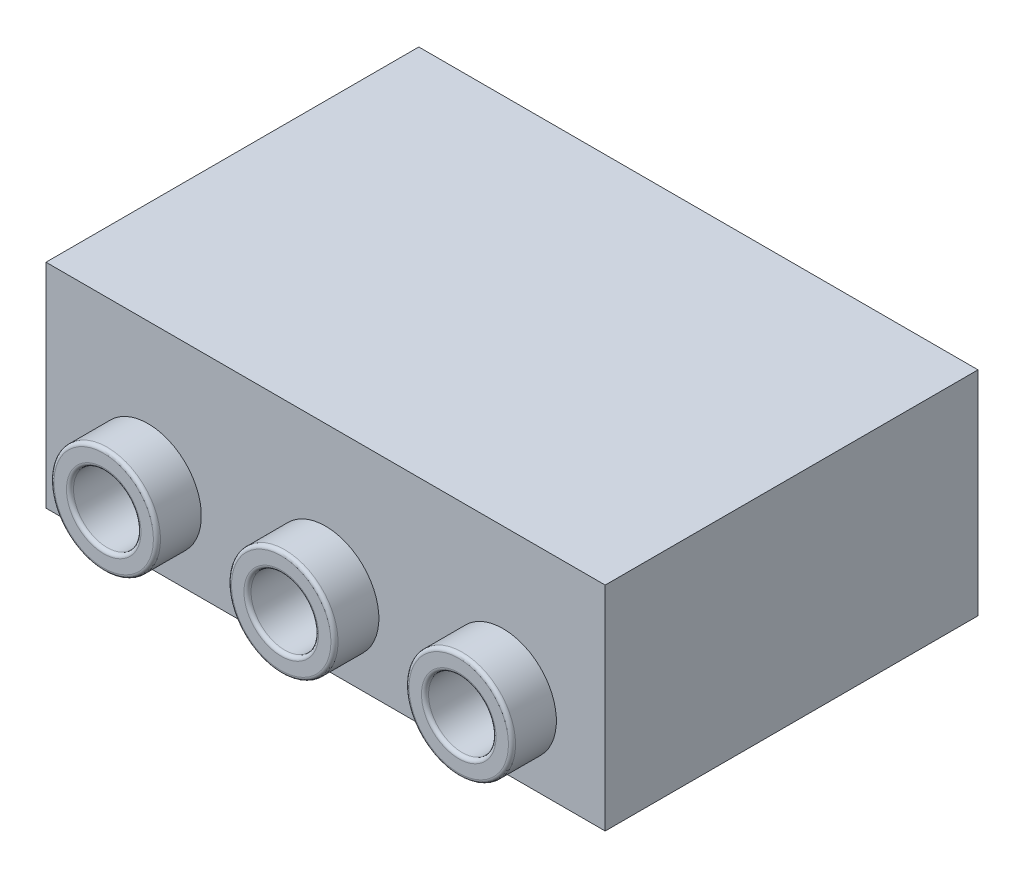
ISO-10303-21;
HEADER;
FILE_DESCRIPTION(('STEP AP214'),'2;1');
FILE_NAME('part.step','',(''),(''),'','','');
FILE_SCHEMA(('AUTOMOTIVE_DESIGN { 1 0 10303 214 1 1 1 1 }'));
ENDSEC;
DATA;
#1=APPLICATION_CONTEXT('core data for automotive mechanical design processes');
#2=APPLICATION_PROTOCOL_DEFINITION('international standard','automotive_design',2000,#1);
#3=PRODUCT_CONTEXT('',#1,'mechanical');
#4=PRODUCT('Part','Part','',(#3));
#5=PRODUCT_RELATED_PRODUCT_CATEGORY('part','',(#4));
#6=PRODUCT_DEFINITION_FORMATION('','',#4);
#7=PRODUCT_DEFINITION_CONTEXT('part definition',#1,'design');
#8=PRODUCT_DEFINITION('design','',#6,#7);
#9=PRODUCT_DEFINITION_SHAPE('','',#8);
#10=(LENGTH_UNIT() NAMED_UNIT(*) SI_UNIT(.MILLI.,.METRE.));
#11=(NAMED_UNIT(*) PLANE_ANGLE_UNIT() SI_UNIT($,.RADIAN.));
#12=(NAMED_UNIT(*) SI_UNIT($,.STERADIAN.) SOLID_ANGLE_UNIT());
#13=UNCERTAINTY_MEASURE_WITH_UNIT(LENGTH_MEASURE(1.E-05),#10,'distance_accuracy_value','');
#14=(GEOMETRIC_REPRESENTATION_CONTEXT(3) GLOBAL_UNCERTAINTY_ASSIGNED_CONTEXT((#13)) GLOBAL_UNIT_ASSIGNED_CONTEXT((#10,
#11,#12)) REPRESENTATION_CONTEXT('',''));
#15=CARTESIAN_POINT('',(0.,0.,0.));
#16=DIRECTION('',(0.,0.,1.));
#17=DIRECTION('',(1.,0.,0.));
#18=AXIS2_PLACEMENT_3D('',#15,#16,#17);
#19=CARTESIAN_POINT('',(15.75,12.,10.5));
#20=DIRECTION('',(-1.,0.,0.));
#21=DIRECTION('',(0.,0.,1.));
#22=AXIS2_PLACEMENT_3D('',#19,#20,#21);
#23=PLANE('',#22);
#24=DIRECTION('',(0.,0.,-1.));
#25=VECTOR('',#24,1.);
#26=CARTESIAN_POINT('',(15.75,0.,10.5));
#27=LINE('',#26,#25);
#28=CARTESIAN_POINT('',(15.75,0.,10.5));
#29=VERTEX_POINT('',#28);
#30=CARTESIAN_POINT('',(15.75,0.,-10.5));
#31=VERTEX_POINT('',#30);
#32=EDGE_CURVE('E121',#29,#31,#27,.T.);
#33=ORIENTED_EDGE('',*,*,#32,.T.);
#34=DIRECTION('',(0.,-1.,0.));
#35=VECTOR('',#34,1.);
#36=CARTESIAN_POINT('',(15.75,12.,-10.5));
#37=LINE('',#36,#35);
#38=CARTESIAN_POINT('',(15.75,12.,-10.5));
#39=VERTEX_POINT('',#38);
#40=EDGE_CURVE('E108',#39,#31,#37,.T.);
#41=ORIENTED_EDGE('',*,*,#40,.F.);
#42=DIRECTION('',(0.,0.,-1.));
#43=VECTOR('',#42,1.);
#44=CARTESIAN_POINT('',(15.75,12.,10.5));
#45=LINE('',#44,#43);
#46=CARTESIAN_POINT('',(15.75,12.,10.5));
#47=VERTEX_POINT('',#46);
#48=EDGE_CURVE('E100',#47,#39,#45,.T.);
#49=ORIENTED_EDGE('',*,*,#48,.F.);
#50=DIRECTION('',(0.,-1.,0.));
#51=VECTOR('',#50,1.);
#52=CARTESIAN_POINT('',(15.75,12.,10.5));
#53=LINE('',#52,#51);
#54=EDGE_CURVE('E117',#47,#29,#53,.T.);
#55=ORIENTED_EDGE('',*,*,#54,.T.);
#56=EDGE_LOOP('',(#33,#41,#49,#55));
#57=FACE_BOUND('',#56,.T.);
#58=ADVANCED_FACE('F44',(#57),#23,.F.);
#59=CARTESIAN_POINT('',(-15.75,12.,-10.5));
#60=DIRECTION('',(0.,0.,1.));
#61=DIRECTION('',(1.,0.,0.));
#62=AXIS2_PLACEMENT_3D('',#59,#60,#61);
#63=PLANE('',#62);
#64=DIRECTION('',(-1.,0.,0.));
#65=VECTOR('',#64,1.);
#66=CARTESIAN_POINT('',(-15.75,0.,-10.5));
#67=LINE('',#66,#65);
#68=CARTESIAN_POINT('',(-15.75,0.,-10.5));
#69=VERTEX_POINT('',#68);
#70=EDGE_CURVE('E106',#31,#69,#67,.T.);
#71=ORIENTED_EDGE('',*,*,#70,.T.);
#72=DIRECTION('',(0.,-1.,0.));
#73=VECTOR('',#72,1.);
#74=CARTESIAN_POINT('',(-15.75,12.,-10.5));
#75=LINE('',#74,#73);
#76=CARTESIAN_POINT('',(-15.75,12.,-10.5));
#77=VERTEX_POINT('',#76);
#78=EDGE_CURVE('E104',#77,#69,#75,.T.);
#79=ORIENTED_EDGE('',*,*,#78,.F.);
#80=DIRECTION('',(-1.,0.,0.));
#81=VECTOR('',#80,1.);
#82=CARTESIAN_POINT('',(-15.75,12.,-10.5));
#83=LINE('',#82,#81);
#84=EDGE_CURVE('E95',#39,#77,#83,.T.);
#85=ORIENTED_EDGE('',*,*,#84,.F.);
#86=ORIENTED_EDGE('',*,*,#40,.T.);
#87=EDGE_LOOP('',(#71,#79,#85,#86));
#88=FACE_BOUND('',#87,.T.);
#89=ADVANCED_FACE('F105',(#88),#63,.F.);
#90=CARTESIAN_POINT('',(-15.75,12.,10.5));
#91=DIRECTION('',(1.,0.,0.));
#92=DIRECTION('',(0.,0.,-1.));
#93=AXIS2_PLACEMENT_3D('',#90,#91,#92);
#94=PLANE('',#93);
#95=DIRECTION('',(0.,0.,1.));
#96=VECTOR('',#95,1.);
#97=CARTESIAN_POINT('',(-15.75,0.,10.5));
#98=LINE('',#97,#96);
#99=CARTESIAN_POINT('',(-15.75,0.,10.5));
#100=VERTEX_POINT('',#99);
#101=EDGE_CURVE('E81',#69,#100,#98,.T.);
#102=ORIENTED_EDGE('',*,*,#101,.T.);
#103=DIRECTION('',(0.,-1.,0.));
#104=VECTOR('',#103,1.);
#105=CARTESIAN_POINT('',(-15.75,12.,10.5));
#106=LINE('',#105,#104);
#107=CARTESIAN_POINT('',(-15.75,12.,10.5));
#108=VERTEX_POINT('',#107);
#109=EDGE_CURVE('E109',#108,#100,#106,.T.);
#110=ORIENTED_EDGE('',*,*,#109,.F.);
#111=DIRECTION('',(0.,0.,1.));
#112=VECTOR('',#111,1.);
#113=CARTESIAN_POINT('',(-15.75,12.,10.5));
#114=LINE('',#113,#112);
#115=EDGE_CURVE('E98',#77,#108,#114,.T.);
#116=ORIENTED_EDGE('',*,*,#115,.F.);
#117=ORIENTED_EDGE('',*,*,#78,.T.);
#118=EDGE_LOOP('',(#102,#110,#116,#117));
#119=FACE_BOUND('',#118,.T.);
#120=ADVANCED_FACE('F111',(#119),#94,.F.);
#121=CARTESIAN_POINT('',(-15.75,12.,10.5));
#122=DIRECTION('',(0.,0.,-1.));
#123=DIRECTION('',(-1.,0.,0.));
#124=AXIS2_PLACEMENT_3D('',#121,#122,#123);
#125=PLANE('',#124);
#126=CARTESIAN_POINT('',(-10.,4.,10.5));
#127=DIRECTION('',(0.,0.,-1.));
#128=DIRECTION('',(-1.,0.,0.));
#129=AXIS2_PLACEMENT_3D('',#126,#127,#128);
#130=CIRCLE('',#129,3.);
#131=CARTESIAN_POINT('',(-13.,4.,10.5));
#132=VERTEX_POINT('',#131);
#133=EDGE_CURVE('E146',#132,#132,#130,.F.);
#134=ORIENTED_EDGE('',*,*,#133,.F.);
#135=EDGE_LOOP('',(#134));
#136=FACE_BOUND('',#135,.T.);
#137=CARTESIAN_POINT('',(10.,4.,10.5));
#138=DIRECTION('',(0.,0.,-1.));
#139=DIRECTION('',(-1.,0.,0.));
#140=AXIS2_PLACEMENT_3D('',#137,#138,#139);
#141=CIRCLE('',#140,3.);
#142=CARTESIAN_POINT('',(7.,4.,10.5));
#143=VERTEX_POINT('',#142);
#144=EDGE_CURVE('E142',#143,#143,#141,.F.);
#145=ORIENTED_EDGE('',*,*,#144,.F.);
#146=EDGE_LOOP('',(#145));
#147=FACE_BOUND('',#146,.T.);
#148=CARTESIAN_POINT('',(0.,4.,10.5));
#149=DIRECTION('',(0.,0.,-1.));
#150=DIRECTION('',(-1.,0.,0.));
#151=AXIS2_PLACEMENT_3D('',#148,#149,#150);
#152=CIRCLE('',#151,3.);
#153=CARTESIAN_POINT('',(-3.,4.,10.5));
#154=VERTEX_POINT('',#153);
#155=EDGE_CURVE('E138',#154,#154,#152,.F.);
#156=ORIENTED_EDGE('',*,*,#155,.F.);
#157=EDGE_LOOP('',(#156));
#158=FACE_BOUND('',#157,.T.);
#159=DIRECTION('',(1.,0.,0.));
#160=VECTOR('',#159,1.);
#161=CARTESIAN_POINT('',(-15.75,0.,10.5));
#162=LINE('',#161,#160);
#163=EDGE_CURVE('E87',#100,#29,#162,.T.);
#164=ORIENTED_EDGE('',*,*,#163,.T.);
#165=ORIENTED_EDGE('',*,*,#54,.F.);
#166=DIRECTION('',(1.,0.,0.));
#167=VECTOR('',#166,1.);
#168=CARTESIAN_POINT('',(-15.75,12.,10.5));
#169=LINE('',#168,#167);
#170=EDGE_CURVE('E64',#108,#47,#169,.T.);
#171=ORIENTED_EDGE('',*,*,#170,.F.);
#172=ORIENTED_EDGE('',*,*,#109,.T.);
#173=EDGE_LOOP('',(#164,#165,#171,#172));
#174=FACE_BOUND('',#173,.T.);
#175=ADVANCED_FACE('F321',(#136,#147,#158,#174),#125,.F.);
#176=CARTESIAN_POINT('',(0.,12.,0.));
#177=DIRECTION('',(0.,-1.,0.));
#178=DIRECTION('',(0.,0.,-1.));
#179=AXIS2_PLACEMENT_3D('',#176,#177,#178);
#180=PLANE('',#179);
#181=ORIENTED_EDGE('',*,*,#48,.T.);
#182=ORIENTED_EDGE('',*,*,#84,.T.);
#183=ORIENTED_EDGE('',*,*,#115,.T.);
#184=ORIENTED_EDGE('',*,*,#170,.T.);
#185=EDGE_LOOP('',(#181,#182,#183,#184));
#186=FACE_BOUND('',#185,.T.);
#187=ADVANCED_FACE('F96',(#186),#180,.F.);
#188=CARTESIAN_POINT('',(0.,0.,0.));
#189=DIRECTION('',(0.,-1.,0.));
#190=DIRECTION('',(0.,0.,-1.));
#191=AXIS2_PLACEMENT_3D('',#188,#189,#190);
#192=PLANE('',#191);
#193=ORIENTED_EDGE('',*,*,#32,.F.);
#194=ORIENTED_EDGE('',*,*,#163,.F.);
#195=ORIENTED_EDGE('',*,*,#101,.F.);
#196=ORIENTED_EDGE('',*,*,#70,.F.);
#197=EDGE_LOOP('',(#193,#194,#195,#196));
#198=FACE_BOUND('',#197,.T.);
#199=ADVANCED_FACE('F203',(#198),#192,.T.);
#200=CARTESIAN_POINT('',(0.,4.,13.));
#201=DIRECTION('',(0.,0.,1.));
#202=DIRECTION('',(1.,0.,0.));
#203=AXIS2_PLACEMENT_3D('',#200,#201,#202);
#204=PLANE('',#203);
#205=CARTESIAN_POINT('',(0.,4.,13.));
#206=DIRECTION('',(0.,0.,1.));
#207=DIRECTION('',(1.,0.,0.));
#208=AXIS2_PLACEMENT_3D('',#205,#206,#207);
#209=CIRCLE('',#208,2.1);
#210=CARTESIAN_POINT('',(2.1,4.,13.));
#211=VERTEX_POINT('',#210);
#212=EDGE_CURVE('E169',#211,#211,#209,.F.);
#213=ORIENTED_EDGE('',*,*,#212,.T.);
#214=EDGE_LOOP('',(#213));
#215=FACE_BOUND('',#214,.T.);
#216=CARTESIAN_POINT('',(0.,4.,13.));
#217=DIRECTION('',(0.,0.,1.));
#218=DIRECTION('',(1.,0.,0.));
#219=AXIS2_PLACEMENT_3D('',#216,#217,#218);
#220=CIRCLE('',#219,2.8);
#221=CARTESIAN_POINT('',(2.8,4.,13.));
#222=VERTEX_POINT('',#221);
#223=EDGE_CURVE('E165',#222,#222,#220,.T.);
#224=ORIENTED_EDGE('',*,*,#223,.T.);
#225=EDGE_LOOP('',(#224));
#226=FACE_BOUND('',#225,.T.);
#227=ADVANCED_FACE('F201',(#215,#226),#204,.T.);
#228=CARTESIAN_POINT('',(0.,4.,13.));
#229=DIRECTION('',(0.,0.,-1.));
#230=DIRECTION('',(-1.,0.,0.));
#231=AXIS2_PLACEMENT_3D('',#228,#229,#230);
#232=CYLINDRICAL_SURFACE('',#231,3.);
#233=CARTESIAN_POINT('',(0.,4.,12.8));
#234=DIRECTION('',(0.,0.,1.));
#235=DIRECTION('',(1.,0.,0.));
#236=AXIS2_PLACEMENT_3D('',#233,#234,#235);
#237=CIRCLE('',#236,3.);
#238=CARTESIAN_POINT('',(3.,4.,12.8));
#239=VERTEX_POINT('',#238);
#240=EDGE_CURVE('E54',#239,#239,#237,.F.);
#241=ORIENTED_EDGE('',*,*,#240,.T.);
#242=EDGE_LOOP('',(#241));
#243=FACE_BOUND('',#242,.T.);
#244=ORIENTED_EDGE('',*,*,#155,.T.);
#245=EDGE_LOOP('',(#244));
#246=FACE_BOUND('',#245,.T.);
#247=ADVANCED_FACE('F192',(#243,#246),#232,.T.);
#248=CARTESIAN_POINT('',(0.,4.,13.));
#249=DIRECTION('',(0.,0.,-1.));
#250=DIRECTION('',(-1.,0.,0.));
#251=AXIS2_PLACEMENT_3D('',#248,#249,#250);
#252=CYLINDRICAL_SURFACE('',#251,1.9);
#253=CARTESIAN_POINT('',(0.,4.,12.8));
#254=DIRECTION('',(0.,0.,1.));
#255=DIRECTION('',(1.,0.,0.));
#256=AXIS2_PLACEMENT_3D('',#253,#254,#255);
#257=CIRCLE('',#256,1.9);
#258=CARTESIAN_POINT('',(1.9,4.,12.8));
#259=VERTEX_POINT('',#258);
#260=EDGE_CURVE('E161',#259,#259,#257,.T.);
#261=ORIENTED_EDGE('',*,*,#260,.T.);
#262=EDGE_LOOP('',(#261));
#263=FACE_BOUND('',#262,.T.);
#264=CARTESIAN_POINT('',(0.,4.,4.5));
#265=DIRECTION('',(0.,0.,1.));
#266=DIRECTION('',(1.,0.,0.));
#267=AXIS2_PLACEMENT_3D('',#264,#265,#266);
#268=CIRCLE('',#267,1.9);
#269=CARTESIAN_POINT('',(1.9,4.,4.5));
#270=VERTEX_POINT('',#269);
#271=EDGE_CURVE('E292',#270,#270,#268,.T.);
#272=ORIENTED_EDGE('',*,*,#271,.F.);
#273=EDGE_LOOP('',(#272));
#274=FACE_BOUND('',#273,.T.);
#275=ADVANCED_FACE('F210',(#263,#274),#252,.F.);
#276=CARTESIAN_POINT('',(10.,4.,13.));
#277=DIRECTION('',(0.,0.,1.));
#278=DIRECTION('',(1.,0.,0.));
#279=AXIS2_PLACEMENT_3D('',#276,#277,#278);
#280=PLANE('',#279);
#281=CARTESIAN_POINT('',(10.,4.,13.));
#282=DIRECTION('',(0.,0.,1.));
#283=DIRECTION('',(1.,0.,0.));
#284=AXIS2_PLACEMENT_3D('',#281,#282,#283);
#285=CIRCLE('',#284,2.1);
#286=CARTESIAN_POINT('',(12.1,4.,13.));
#287=VERTEX_POINT('',#286);
#288=EDGE_CURVE('E180',#287,#287,#285,.F.);
#289=ORIENTED_EDGE('',*,*,#288,.T.);
#290=EDGE_LOOP('',(#289));
#291=FACE_BOUND('',#290,.T.);
#292=CARTESIAN_POINT('',(10.,4.,13.));
#293=DIRECTION('',(0.,0.,1.));
#294=DIRECTION('',(1.,0.,0.));
#295=AXIS2_PLACEMENT_3D('',#292,#293,#294);
#296=CIRCLE('',#295,2.8);
#297=CARTESIAN_POINT('',(12.8,4.,13.));
#298=VERTEX_POINT('',#297);
#299=EDGE_CURVE('E177',#298,#298,#296,.T.);
#300=ORIENTED_EDGE('',*,*,#299,.T.);
#301=EDGE_LOOP('',(#300));
#302=FACE_BOUND('',#301,.T.);
#303=ADVANCED_FACE('F245',(#291,#302),#280,.T.);
#304=CARTESIAN_POINT('',(10.,4.,13.));
#305=DIRECTION('',(0.,0.,-1.));
#306=DIRECTION('',(-1.,0.,0.));
#307=AXIS2_PLACEMENT_3D('',#304,#305,#306);
#308=CYLINDRICAL_SURFACE('',#307,3.);
#309=CARTESIAN_POINT('',(10.,4.,12.8));
#310=DIRECTION('',(0.,0.,1.));
#311=DIRECTION('',(1.,0.,0.));
#312=AXIS2_PLACEMENT_3D('',#309,#310,#311);
#313=CIRCLE('',#312,3.);
#314=CARTESIAN_POINT('',(13.,4.,12.8));
#315=VERTEX_POINT('',#314);
#316=EDGE_CURVE('E184',#315,#315,#313,.F.);
#317=ORIENTED_EDGE('',*,*,#316,.T.);
#318=EDGE_LOOP('',(#317));
#319=FACE_BOUND('',#318,.T.);
#320=ORIENTED_EDGE('',*,*,#144,.T.);
#321=EDGE_LOOP('',(#320));
#322=FACE_BOUND('',#321,.T.);
#323=ADVANCED_FACE('F247',(#319,#322),#308,.T.);
#324=CARTESIAN_POINT('',(10.,4.,13.));
#325=DIRECTION('',(0.,0.,-1.));
#326=DIRECTION('',(-1.,0.,0.));
#327=AXIS2_PLACEMENT_3D('',#324,#325,#326);
#328=CYLINDRICAL_SURFACE('',#327,1.9);
#329=CARTESIAN_POINT('',(10.,4.,12.8));
#330=DIRECTION('',(0.,0.,1.));
#331=DIRECTION('',(1.,0.,0.));
#332=AXIS2_PLACEMENT_3D('',#329,#330,#331);
#333=CIRCLE('',#332,1.9);
#334=CARTESIAN_POINT('',(11.9,4.,12.8));
#335=VERTEX_POINT('',#334);
#336=EDGE_CURVE('E173',#335,#335,#333,.T.);
#337=ORIENTED_EDGE('',*,*,#336,.T.);
#338=EDGE_LOOP('',(#337));
#339=FACE_BOUND('',#338,.T.);
#340=CARTESIAN_POINT('',(10.,4.,4.5));
#341=DIRECTION('',(0.,0.,1.));
#342=DIRECTION('',(1.,0.,0.));
#343=AXIS2_PLACEMENT_3D('',#340,#341,#342);
#344=CIRCLE('',#343,1.9);
#345=CARTESIAN_POINT('',(11.9,4.,4.5));
#346=VERTEX_POINT('',#345);
#347=EDGE_CURVE('E296',#346,#346,#344,.T.);
#348=ORIENTED_EDGE('',*,*,#347,.F.);
#349=EDGE_LOOP('',(#348));
#350=FACE_BOUND('',#349,.T.);
#351=ADVANCED_FACE('F254',(#339,#350),#328,.F.);
#352=CARTESIAN_POINT('',(-10.,4.,13.));
#353=DIRECTION('',(0.,0.,1.));
#354=DIRECTION('',(1.,0.,0.));
#355=AXIS2_PLACEMENT_3D('',#352,#353,#354);
#356=PLANE('',#355);
#357=CARTESIAN_POINT('',(-10.,4.,13.));
#358=DIRECTION('',(0.,0.,1.));
#359=DIRECTION('',(1.,0.,0.));
#360=AXIS2_PLACEMENT_3D('',#357,#358,#359);
#361=CIRCLE('',#360,2.1);
#362=CARTESIAN_POINT('',(-7.9,4.,13.));
#363=VERTEX_POINT('',#362);
#364=EDGE_CURVE('E158',#363,#363,#361,.F.);
#365=ORIENTED_EDGE('',*,*,#364,.T.);
#366=EDGE_LOOP('',(#365));
#367=FACE_BOUND('',#366,.T.);
#368=CARTESIAN_POINT('',(-10.,4.,13.));
#369=DIRECTION('',(0.,0.,1.));
#370=DIRECTION('',(1.,0.,0.));
#371=AXIS2_PLACEMENT_3D('',#368,#369,#370);
#372=CIRCLE('',#371,2.8);
#373=CARTESIAN_POINT('',(-7.2,4.,13.));
#374=VERTEX_POINT('',#373);
#375=EDGE_CURVE('E154',#374,#374,#372,.T.);
#376=ORIENTED_EDGE('',*,*,#375,.T.);
#377=EDGE_LOOP('',(#376));
#378=FACE_BOUND('',#377,.T.);
#379=ADVANCED_FACE('F261',(#367,#378),#356,.T.);
#380=CARTESIAN_POINT('',(-10.,4.,13.));
#381=DIRECTION('',(0.,0.,-1.));
#382=DIRECTION('',(-1.,0.,0.));
#383=AXIS2_PLACEMENT_3D('',#380,#381,#382);
#384=CYLINDRICAL_SURFACE('',#383,3.);
#385=CARTESIAN_POINT('',(-10.,4.,12.8));
#386=DIRECTION('',(0.,0.,1.));
#387=DIRECTION('',(1.,0.,0.));
#388=AXIS2_PLACEMENT_3D('',#385,#386,#387);
#389=CIRCLE('',#388,3.);
#390=CARTESIAN_POINT('',(-7.,4.,12.8));
#391=VERTEX_POINT('',#390);
#392=EDGE_CURVE('E11',#391,#391,#389,.F.);
#393=ORIENTED_EDGE('',*,*,#392,.T.);
#394=EDGE_LOOP('',(#393));
#395=FACE_BOUND('',#394,.T.);
#396=ORIENTED_EDGE('',*,*,#133,.T.);
#397=EDGE_LOOP('',(#396));
#398=FACE_BOUND('',#397,.T.);
#399=ADVANCED_FACE('F263',(#395,#398),#384,.T.);
#400=CARTESIAN_POINT('',(-10.,4.,13.));
#401=DIRECTION('',(0.,0.,-1.));
#402=DIRECTION('',(-1.,0.,0.));
#403=AXIS2_PLACEMENT_3D('',#400,#401,#402);
#404=CYLINDRICAL_SURFACE('',#403,1.9);
#405=CARTESIAN_POINT('',(-10.,4.,12.8));
#406=DIRECTION('',(0.,0.,1.));
#407=DIRECTION('',(1.,0.,0.));
#408=AXIS2_PLACEMENT_3D('',#405,#406,#407);
#409=CIRCLE('',#408,1.9);
#410=CARTESIAN_POINT('',(-8.1,4.,12.8));
#411=VERTEX_POINT('',#410);
#412=EDGE_CURVE('E150',#411,#411,#409,.T.);
#413=ORIENTED_EDGE('',*,*,#412,.T.);
#414=EDGE_LOOP('',(#413));
#415=FACE_BOUND('',#414,.T.);
#416=CARTESIAN_POINT('',(-10.,4.,4.5));
#417=DIRECTION('',(0.,0.,1.));
#418=DIRECTION('',(1.,0.,0.));
#419=AXIS2_PLACEMENT_3D('',#416,#417,#418);
#420=CIRCLE('',#419,1.9);
#421=CARTESIAN_POINT('',(-8.1,4.,4.5));
#422=VERTEX_POINT('',#421);
#423=EDGE_CURVE('E125',#422,#422,#420,.T.);
#424=ORIENTED_EDGE('',*,*,#423,.F.);
#425=EDGE_LOOP('',(#424));
#426=FACE_BOUND('',#425,.T.);
#427=ADVANCED_FACE('F228',(#415,#426),#404,.F.);
#428=CARTESIAN_POINT('',(-10.,4.,12.8));
#429=DIRECTION('',(0.,0.,1.));
#430=DIRECTION('',(1.,0.,0.));
#431=AXIS2_PLACEMENT_3D('',#428,#429,#430);
#432=TOROIDAL_SURFACE('',#431,2.1,0.2);
#433=ORIENTED_EDGE('',*,*,#364,.F.);
#434=EDGE_LOOP('',(#433));
#435=FACE_BOUND('',#434,.T.);
#436=ORIENTED_EDGE('',*,*,#412,.F.);
#437=EDGE_LOOP('',(#436));
#438=FACE_BOUND('',#437,.T.);
#439=ADVANCED_FACE('F224',(#435,#438),#432,.T.);
#440=CARTESIAN_POINT('',(0.,4.,12.8));
#441=DIRECTION('',(0.,0.,1.));
#442=DIRECTION('',(1.,0.,0.));
#443=AXIS2_PLACEMENT_3D('',#440,#441,#442);
#444=TOROIDAL_SURFACE('',#443,2.1,0.2);
#445=ORIENTED_EDGE('',*,*,#212,.F.);
#446=EDGE_LOOP('',(#445));
#447=FACE_BOUND('',#446,.T.);
#448=ORIENTED_EDGE('',*,*,#260,.F.);
#449=EDGE_LOOP('',(#448));
#450=FACE_BOUND('',#449,.T.);
#451=ADVANCED_FACE('F227',(#447,#450),#444,.T.);
#452=CARTESIAN_POINT('',(10.,4.,12.8));
#453=DIRECTION('',(0.,0.,1.));
#454=DIRECTION('',(1.,0.,0.));
#455=AXIS2_PLACEMENT_3D('',#452,#453,#454);
#456=TOROIDAL_SURFACE('',#455,2.1,0.2);
#457=ORIENTED_EDGE('',*,*,#288,.F.);
#458=EDGE_LOOP('',(#457));
#459=FACE_BOUND('',#458,.T.);
#460=ORIENTED_EDGE('',*,*,#336,.F.);
#461=EDGE_LOOP('',(#460));
#462=FACE_BOUND('',#461,.T.);
#463=ADVANCED_FACE('F232',(#459,#462),#456,.T.);
#464=CARTESIAN_POINT('',(10.,4.,12.8));
#465=DIRECTION('',(0.,0.,1.));
#466=DIRECTION('',(1.,0.,0.));
#467=AXIS2_PLACEMENT_3D('',#464,#465,#466);
#468=TOROIDAL_SURFACE('',#467,2.8,0.2);
#469=ORIENTED_EDGE('',*,*,#316,.F.);
#470=EDGE_LOOP('',(#469));
#471=FACE_BOUND('',#470,.T.);
#472=ORIENTED_EDGE('',*,*,#299,.F.);
#473=EDGE_LOOP('',(#472));
#474=FACE_BOUND('',#473,.T.);
#475=ADVANCED_FACE('F198',(#471,#474),#468,.T.);
#476=CARTESIAN_POINT('',(0.,4.,12.8));
#477=DIRECTION('',(0.,0.,1.));
#478=DIRECTION('',(1.,0.,0.));
#479=AXIS2_PLACEMENT_3D('',#476,#477,#478);
#480=TOROIDAL_SURFACE('',#479,2.8,0.2);
#481=ORIENTED_EDGE('',*,*,#240,.F.);
#482=EDGE_LOOP('',(#481));
#483=FACE_BOUND('',#482,.T.);
#484=ORIENTED_EDGE('',*,*,#223,.F.);
#485=EDGE_LOOP('',(#484));
#486=FACE_BOUND('',#485,.T.);
#487=ADVANCED_FACE('F195',(#483,#486),#480,.T.);
#488=CARTESIAN_POINT('',(-10.,4.,12.8));
#489=DIRECTION('',(0.,0.,1.));
#490=DIRECTION('',(1.,0.,0.));
#491=AXIS2_PLACEMENT_3D('',#488,#489,#490);
#492=TOROIDAL_SURFACE('',#491,2.8,0.2);
#493=ORIENTED_EDGE('',*,*,#392,.F.);
#494=EDGE_LOOP('',(#493));
#495=FACE_BOUND('',#494,.T.);
#496=ORIENTED_EDGE('',*,*,#375,.F.);
#497=EDGE_LOOP('',(#496));
#498=FACE_BOUND('',#497,.T.);
#499=ADVANCED_FACE('F46',(#495,#498),#492,.T.);
#500=CARTESIAN_POINT('',(-10.,4.,4.5));
#501=DIRECTION('',(0.,0.,1.));
#502=DIRECTION('',(1.,0.,0.));
#503=AXIS2_PLACEMENT_3D('',#500,#501,#502);
#504=PLANE('',#503);
#505=ORIENTED_EDGE('',*,*,#423,.T.);
#506=EDGE_LOOP('',(#505));
#507=FACE_BOUND('',#506,.T.);
#508=ADVANCED_FACE('F277',(#507),#504,.T.);
#509=CARTESIAN_POINT('',(10.,4.,4.5));
#510=DIRECTION('',(0.,0.,1.));
#511=DIRECTION('',(1.,0.,0.));
#512=AXIS2_PLACEMENT_3D('',#509,#510,#511);
#513=PLANE('',#512);
#514=ORIENTED_EDGE('',*,*,#347,.T.);
#515=EDGE_LOOP('',(#514));
#516=FACE_BOUND('',#515,.T.);
#517=ADVANCED_FACE('F273',(#516),#513,.T.);
#518=CARTESIAN_POINT('',(0.,4.,4.5));
#519=DIRECTION('',(0.,0.,1.));
#520=DIRECTION('',(1.,0.,0.));
#521=AXIS2_PLACEMENT_3D('',#518,#519,#520);
#522=PLANE('',#521);
#523=ORIENTED_EDGE('',*,*,#271,.T.);
#524=EDGE_LOOP('',(#523));
#525=FACE_BOUND('',#524,.T.);
#526=ADVANCED_FACE('F276',(#525),#522,.T.);
#527=CLOSED_SHELL('',(#58,#89,#120,#175,#187,#199,#227,#247,#275,#303,#323,#351,#379,#399,#427,
#439,#451,#463,#475,#487,#499,#508,#517,#526));
#528=MANIFOLD_SOLID_BREP('B2',#527);
#529=ADVANCED_BREP_SHAPE_REPRESENTATION('',(#18,#528),#14);
#530=SHAPE_DEFINITION_REPRESENTATION(#9,#529);
ENDSEC;
END-ISO-10303-21;
